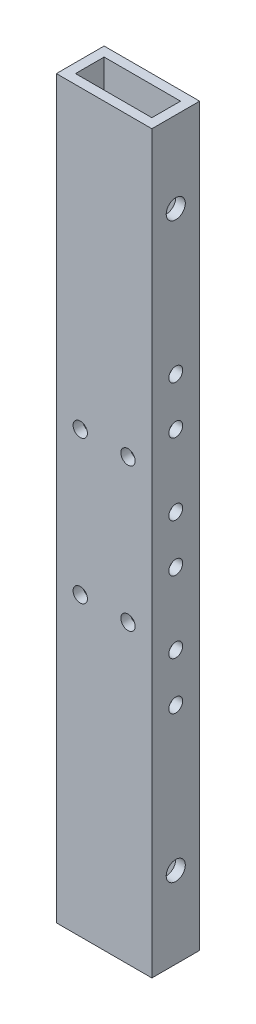
ISO-10303-21;
HEADER;
FILE_DESCRIPTION(('STEP AP214'),'2;1');
FILE_NAME('part.step','',(''),(''),'','','');
FILE_SCHEMA(('AUTOMOTIVE_DESIGN { 1 0 10303 214 1 1 1 1 }'));
ENDSEC;
DATA;
#1=APPLICATION_CONTEXT('core data for automotive mechanical design processes');
#2=APPLICATION_PROTOCOL_DEFINITION('international standard','automotive_design',2000,#1);
#3=PRODUCT_CONTEXT('',#1,'mechanical');
#4=PRODUCT('Part','Part','',(#3));
#5=PRODUCT_RELATED_PRODUCT_CATEGORY('part','',(#4));
#6=PRODUCT_DEFINITION_FORMATION('','',#4);
#7=PRODUCT_DEFINITION_CONTEXT('part definition',#1,'design');
#8=PRODUCT_DEFINITION('design','',#6,#7);
#9=PRODUCT_DEFINITION_SHAPE('','',#8);
#10=(LENGTH_UNIT() NAMED_UNIT(*) SI_UNIT(.MILLI.,.METRE.));
#11=(NAMED_UNIT(*) PLANE_ANGLE_UNIT() SI_UNIT($,.RADIAN.));
#12=(NAMED_UNIT(*) SI_UNIT($,.STERADIAN.) SOLID_ANGLE_UNIT());
#13=UNCERTAINTY_MEASURE_WITH_UNIT(LENGTH_MEASURE(1.E-05),#10,'distance_accuracy_value','');
#14=(GEOMETRIC_REPRESENTATION_CONTEXT(3) GLOBAL_UNCERTAINTY_ASSIGNED_CONTEXT((#13)) GLOBAL_UNIT_ASSIGNED_CONTEXT((#10,
#11,#12)) REPRESENTATION_CONTEXT('',''));
#15=CARTESIAN_POINT('',(0.,0.,0.));
#16=DIRECTION('',(0.,0.,1.));
#17=DIRECTION('',(1.,0.,0.));
#18=AXIS2_PLACEMENT_3D('',#15,#16,#17);
#19=CARTESIAN_POINT('',(0.,77.,0.));
#20=DIRECTION('',(0.,1.,0.));
#21=DIRECTION('',(0.,0.,1.));
#22=AXIS2_PLACEMENT_3D('',#19,#20,#21);
#23=PLANE('',#22);
#24=DIRECTION('',(0.,0.,-1.));
#25=VECTOR('',#24,1.);
#26=CARTESIAN_POINT('',(10.,77.,-5.));
#27=LINE('',#26,#25);
#28=CARTESIAN_POINT('',(10.,77.,5.));
#29=VERTEX_POINT('',#28);
#30=CARTESIAN_POINT('',(10.,77.,-5.));
#31=VERTEX_POINT('',#30);
#32=EDGE_CURVE('E140',#29,#31,#27,.T.);
#33=ORIENTED_EDGE('',*,*,#32,.T.);
#34=DIRECTION('',(-1.,0.,0.));
#35=VECTOR('',#34,1.);
#36=CARTESIAN_POINT('',(-10.,77.,-5.));
#37=LINE('',#36,#35);
#38=CARTESIAN_POINT('',(-10.,77.,-5.));
#39=VERTEX_POINT('',#38);
#40=EDGE_CURVE('E143',#31,#39,#37,.T.);
#41=ORIENTED_EDGE('',*,*,#40,.T.);
#42=DIRECTION('',(0.,0.,1.));
#43=VECTOR('',#42,1.);
#44=CARTESIAN_POINT('',(-10.,77.,-5.));
#45=LINE('',#44,#43);
#46=CARTESIAN_POINT('',(-10.,77.,5.));
#47=VERTEX_POINT('',#46);
#48=EDGE_CURVE('E146',#39,#47,#45,.T.);
#49=ORIENTED_EDGE('',*,*,#48,.T.);
#50=DIRECTION('',(1.,0.,0.));
#51=VECTOR('',#50,1.);
#52=CARTESIAN_POINT('',(-10.,77.,5.));
#53=LINE('',#52,#51);
#54=EDGE_CURVE('E148',#47,#29,#53,.T.);
#55=ORIENTED_EDGE('',*,*,#54,.T.);
#56=EDGE_LOOP('',(#33,#41,#49,#55));
#57=FACE_BOUND('',#56,.T.);
#58=DIRECTION('',(-1.,0.,0.));
#59=VECTOR('',#58,1.);
#60=CARTESIAN_POINT('',(-8.,77.,-3.));
#61=LINE('',#60,#59);
#62=CARTESIAN_POINT('',(8.,77.,-3.));
#63=VERTEX_POINT('',#62);
#64=CARTESIAN_POINT('',(-8.,77.,-3.));
#65=VERTEX_POINT('',#64);
#66=EDGE_CURVE('E110',#63,#65,#61,.T.);
#67=ORIENTED_EDGE('',*,*,#66,.F.);
#68=DIRECTION('',(0.,0.,-1.));
#69=VECTOR('',#68,1.);
#70=CARTESIAN_POINT('',(8.,77.,-3.));
#71=LINE('',#70,#69);
#72=CARTESIAN_POINT('',(8.,77.,3.));
#73=VERTEX_POINT('',#72);
#74=EDGE_CURVE('E102',#73,#63,#71,.T.);
#75=ORIENTED_EDGE('',*,*,#74,.F.);
#76=DIRECTION('',(1.,0.,0.));
#77=VECTOR('',#76,1.);
#78=CARTESIAN_POINT('',(-8.,77.,3.));
#79=LINE('',#78,#77);
#80=CARTESIAN_POINT('',(-8.,77.,3.));
#81=VERTEX_POINT('',#80);
#82=EDGE_CURVE('E124',#81,#73,#79,.T.);
#83=ORIENTED_EDGE('',*,*,#82,.F.);
#84=DIRECTION('',(0.,0.,1.));
#85=VECTOR('',#84,1.);
#86=CARTESIAN_POINT('',(-8.,77.,-3.));
#87=LINE('',#86,#85);
#88=EDGE_CURVE('E122',#65,#81,#87,.T.);
#89=ORIENTED_EDGE('',*,*,#88,.F.);
#90=EDGE_LOOP('',(#67,#75,#83,#89));
#91=FACE_BOUND('',#90,.T.);
#92=ADVANCED_FACE('F35',(#57,#91),#23,.T.);
#93=CARTESIAN_POINT('',(0.,-77.,0.));
#94=DIRECTION('',(0.,1.,0.));
#95=DIRECTION('',(0.,0.,1.));
#96=AXIS2_PLACEMENT_3D('',#93,#94,#95);
#97=PLANE('',#96);
#98=DIRECTION('',(0.,0.,-1.));
#99=VECTOR('',#98,1.);
#100=CARTESIAN_POINT('',(10.,-77.,-5.));
#101=LINE('',#100,#99);
#102=CARTESIAN_POINT('',(10.,-77.,5.));
#103=VERTEX_POINT('',#102);
#104=CARTESIAN_POINT('',(10.,-77.,-5.));
#105=VERTEX_POINT('',#104);
#106=EDGE_CURVE('E118',#103,#105,#101,.T.);
#107=ORIENTED_EDGE('',*,*,#106,.F.);
#108=DIRECTION('',(1.,0.,0.));
#109=VECTOR('',#108,1.);
#110=CARTESIAN_POINT('',(-10.,-77.,5.));
#111=LINE('',#110,#109);
#112=CARTESIAN_POINT('',(-10.,-77.,5.));
#113=VERTEX_POINT('',#112);
#114=EDGE_CURVE('E144',#113,#103,#111,.T.);
#115=ORIENTED_EDGE('',*,*,#114,.F.);
#116=DIRECTION('',(0.,0.,1.));
#117=VECTOR('',#116,1.);
#118=CARTESIAN_POINT('',(-10.,-77.,-5.));
#119=LINE('',#118,#117);
#120=CARTESIAN_POINT('',(-10.,-77.,-5.));
#121=VERTEX_POINT('',#120);
#122=EDGE_CURVE('E155',#121,#113,#119,.T.);
#123=ORIENTED_EDGE('',*,*,#122,.F.);
#124=DIRECTION('',(-1.,0.,0.));
#125=VECTOR('',#124,1.);
#126=CARTESIAN_POINT('',(-10.,-77.,-5.));
#127=LINE('',#126,#125);
#128=EDGE_CURVE('E153',#105,#121,#127,.T.);
#129=ORIENTED_EDGE('',*,*,#128,.F.);
#130=EDGE_LOOP('',(#107,#115,#123,#129));
#131=FACE_BOUND('',#130,.T.);
#132=DIRECTION('',(0.,0.,-1.));
#133=VECTOR('',#132,1.);
#134=CARTESIAN_POINT('',(8.,-77.,-3.));
#135=LINE('',#134,#133);
#136=CARTESIAN_POINT('',(8.,-77.,3.));
#137=VERTEX_POINT('',#136);
#138=CARTESIAN_POINT('',(8.,-77.,-3.));
#139=VERTEX_POINT('',#138);
#140=EDGE_CURVE('E60',#137,#139,#135,.T.);
#141=ORIENTED_EDGE('',*,*,#140,.T.);
#142=DIRECTION('',(-1.,0.,0.));
#143=VECTOR('',#142,1.);
#144=CARTESIAN_POINT('',(-8.,-77.,-3.));
#145=LINE('',#144,#143);
#146=CARTESIAN_POINT('',(-8.,-77.,-3.));
#147=VERTEX_POINT('',#146);
#148=EDGE_CURVE('E117',#139,#147,#145,.T.);
#149=ORIENTED_EDGE('',*,*,#148,.T.);
#150=DIRECTION('',(0.,0.,1.));
#151=VECTOR('',#150,1.);
#152=CARTESIAN_POINT('',(-8.,-77.,-3.));
#153=LINE('',#152,#151);
#154=CARTESIAN_POINT('',(-8.,-77.,3.));
#155=VERTEX_POINT('',#154);
#156=EDGE_CURVE('E132',#147,#155,#153,.T.);
#157=ORIENTED_EDGE('',*,*,#156,.T.);
#158=DIRECTION('',(1.,0.,0.));
#159=VECTOR('',#158,1.);
#160=CARTESIAN_POINT('',(-8.,-77.,3.));
#161=LINE('',#160,#159);
#162=EDGE_CURVE('E111',#155,#137,#161,.T.);
#163=ORIENTED_EDGE('',*,*,#162,.T.);
#164=EDGE_LOOP('',(#141,#149,#157,#163));
#165=FACE_BOUND('',#164,.T.);
#166=ADVANCED_FACE('F318',(#131,#165),#97,.F.);
#167=CARTESIAN_POINT('',(10.,77.,-5.));
#168=DIRECTION('',(-1.,0.,0.));
#169=DIRECTION('',(0.,0.,1.));
#170=AXIS2_PLACEMENT_3D('',#167,#168,#169);
#171=PLANE('',#170);
#172=CARTESIAN_POINT('',(10.,20.,0.));
#173=DIRECTION('',(1.,0.,0.));
#174=DIRECTION('',(0.,0.,-1.));
#175=AXIS2_PLACEMENT_3D('',#172,#173,#174);
#176=CIRCLE('',#175,1.45);
#177=CARTESIAN_POINT('',(10.,20.,-1.45));
#178=VERTEX_POINT('',#177);
#179=EDGE_CURVE('E245',#178,#178,#176,.T.);
#180=ORIENTED_EDGE('',*,*,#179,.F.);
#181=EDGE_LOOP('',(#180));
#182=FACE_BOUND('',#181,.T.);
#183=CARTESIAN_POINT('',(10.,30.,0.));
#184=DIRECTION('',(1.,0.,0.));
#185=DIRECTION('',(0.,0.,-1.));
#186=AXIS2_PLACEMENT_3D('',#183,#184,#185);
#187=CIRCLE('',#186,1.45);
#188=CARTESIAN_POINT('',(10.,30.,-1.45));
#189=VERTEX_POINT('',#188);
#190=EDGE_CURVE('E251',#189,#189,#187,.T.);
#191=ORIENTED_EDGE('',*,*,#190,.F.);
#192=EDGE_LOOP('',(#191));
#193=FACE_BOUND('',#192,.T.);
#194=CARTESIAN_POINT('',(10.,-30.,0.));
#195=DIRECTION('',(1.,0.,0.));
#196=DIRECTION('',(0.,0.,1.));
#197=AXIS2_PLACEMENT_3D('',#194,#195,#196);
#198=CIRCLE('',#197,1.45);
#199=CARTESIAN_POINT('',(10.,-30.,1.45));
#200=VERTEX_POINT('',#199);
#201=EDGE_CURVE('E257',#200,#200,#198,.T.);
#202=ORIENTED_EDGE('',*,*,#201,.F.);
#203=EDGE_LOOP('',(#202));
#204=FACE_BOUND('',#203,.T.);
#205=CARTESIAN_POINT('',(10.,-20.,0.));
#206=DIRECTION('',(1.,0.,0.));
#207=DIRECTION('',(0.,0.,1.));
#208=AXIS2_PLACEMENT_3D('',#205,#206,#207);
#209=CIRCLE('',#208,1.45);
#210=CARTESIAN_POINT('',(10.,-20.,1.45));
#211=VERTEX_POINT('',#210);
#212=EDGE_CURVE('E226',#211,#211,#209,.T.);
#213=ORIENTED_EDGE('',*,*,#212,.F.);
#214=EDGE_LOOP('',(#213));
#215=FACE_BOUND('',#214,.T.);
#216=CARTESIAN_POINT('',(10.,-5.,0.));
#217=DIRECTION('',(1.,0.,0.));
#218=DIRECTION('',(0.,0.,1.));
#219=AXIS2_PLACEMENT_3D('',#216,#217,#218);
#220=CIRCLE('',#219,1.45);
#221=CARTESIAN_POINT('',(10.,-5.,1.45));
#222=VERTEX_POINT('',#221);
#223=EDGE_CURVE('E227',#222,#222,#220,.T.);
#224=ORIENTED_EDGE('',*,*,#223,.F.);
#225=EDGE_LOOP('',(#224));
#226=FACE_BOUND('',#225,.T.);
#227=CARTESIAN_POINT('',(10.,60.,0.));
#228=DIRECTION('',(1.,0.,0.));
#229=DIRECTION('',(0.,0.,-1.));
#230=AXIS2_PLACEMENT_3D('',#227,#228,#229);
#231=CIRCLE('',#230,2.);
#232=CARTESIAN_POINT('',(10.,60.,-1.99999999999999));
#233=VERTEX_POINT('',#232);
#234=EDGE_CURVE('E233',#233,#233,#231,.T.);
#235=ORIENTED_EDGE('',*,*,#234,.F.);
#236=EDGE_LOOP('',(#235));
#237=FACE_BOUND('',#236,.T.);
#238=CARTESIAN_POINT('',(10.,-60.,0.));
#239=DIRECTION('',(1.,0.,0.));
#240=DIRECTION('',(0.,0.,1.));
#241=AXIS2_PLACEMENT_3D('',#238,#239,#240);
#242=CIRCLE('',#241,2.);
#243=CARTESIAN_POINT('',(10.,-60.,1.99999999999999));
#244=VERTEX_POINT('',#243);
#245=EDGE_CURVE('E222',#244,#244,#242,.T.);
#246=ORIENTED_EDGE('',*,*,#245,.F.);
#247=EDGE_LOOP('',(#246));
#248=FACE_BOUND('',#247,.T.);
#249=CARTESIAN_POINT('',(10.,5.,0.));
#250=DIRECTION('',(1.,0.,0.));
#251=DIRECTION('',(0.,0.,-1.));
#252=AXIS2_PLACEMENT_3D('',#249,#250,#251);
#253=CIRCLE('',#252,1.45);
#254=CARTESIAN_POINT('',(10.,5.,-1.45));
#255=VERTEX_POINT('',#254);
#256=EDGE_CURVE('E244',#255,#255,#253,.T.);
#257=ORIENTED_EDGE('',*,*,#256,.F.);
#258=EDGE_LOOP('',(#257));
#259=FACE_BOUND('',#258,.T.);
#260=ORIENTED_EDGE('',*,*,#106,.T.);
#261=DIRECTION('',(0.,-1.,0.));
#262=VECTOR('',#261,1.);
#263=CARTESIAN_POINT('',(10.,77.,-5.));
#264=LINE('',#263,#262);
#265=EDGE_CURVE('E11',#31,#105,#264,.T.);
#266=ORIENTED_EDGE('',*,*,#265,.F.);
#267=ORIENTED_EDGE('',*,*,#32,.F.);
#268=DIRECTION('',(0.,-1.,0.));
#269=VECTOR('',#268,1.);
#270=CARTESIAN_POINT('',(10.,77.,5.));
#271=LINE('',#270,#269);
#272=EDGE_CURVE('E150',#29,#103,#271,.T.);
#273=ORIENTED_EDGE('',*,*,#272,.T.);
#274=EDGE_LOOP('',(#260,#266,#267,#273));
#275=FACE_BOUND('',#274,.T.);
#276=ADVANCED_FACE('F37',(#182,#193,#204,#215,#226,#237,#248,#259,#275),#171,.F.);
#277=CARTESIAN_POINT('',(-10.,77.,-5.));
#278=DIRECTION('',(0.,0.,1.));
#279=DIRECTION('',(1.,0.,0.));
#280=AXIS2_PLACEMENT_3D('',#277,#278,#279);
#281=PLANE('',#280);
#282=CARTESIAN_POINT('',(5.,-14.9999999999998,-5.));
#283=DIRECTION('',(0.,0.,-1.));
#284=DIRECTION('',(-1.,0.,0.));
#285=AXIS2_PLACEMENT_3D('',#282,#283,#284);
#286=CIRCLE('',#285,1.5);
#287=CARTESIAN_POINT('',(3.5,-14.9999999999998,-5.));
#288=VERTEX_POINT('',#287);
#289=EDGE_CURVE('E443',#288,#288,#286,.T.);
#290=ORIENTED_EDGE('',*,*,#289,.F.);
#291=EDGE_LOOP('',(#290));
#292=FACE_BOUND('',#291,.T.);
#293=CARTESIAN_POINT('',(-5.,14.9999999999998,-5.));
#294=DIRECTION('',(0.,0.,-1.));
#295=DIRECTION('',(1.,0.,0.));
#296=AXIS2_PLACEMENT_3D('',#293,#294,#295);
#297=CIRCLE('',#296,1.5);
#298=CARTESIAN_POINT('',(-3.5,14.9999999999998,-5.));
#299=VERTEX_POINT('',#298);
#300=EDGE_CURVE('E436',#299,#299,#297,.T.);
#301=ORIENTED_EDGE('',*,*,#300,.F.);
#302=EDGE_LOOP('',(#301));
#303=FACE_BOUND('',#302,.T.);
#304=CARTESIAN_POINT('',(5.,14.9999999999998,-5.));
#305=DIRECTION('',(0.,0.,-1.));
#306=DIRECTION('',(1.,0.,0.));
#307=AXIS2_PLACEMENT_3D('',#304,#305,#306);
#308=CIRCLE('',#307,1.5);
#309=CARTESIAN_POINT('',(6.5,14.9999999999998,-5.));
#310=VERTEX_POINT('',#309);
#311=EDGE_CURVE('E431',#310,#310,#308,.T.);
#312=ORIENTED_EDGE('',*,*,#311,.F.);
#313=EDGE_LOOP('',(#312));
#314=FACE_BOUND('',#313,.T.);
#315=CARTESIAN_POINT('',(-5.,-14.9999999999998,-5.));
#316=DIRECTION('',(0.,0.,-1.));
#317=DIRECTION('',(-1.,0.,0.));
#318=AXIS2_PLACEMENT_3D('',#315,#316,#317);
#319=CIRCLE('',#318,1.5);
#320=CARTESIAN_POINT('',(-6.5,-14.9999999999998,-5.));
#321=VERTEX_POINT('',#320);
#322=EDGE_CURVE('E442',#321,#321,#319,.T.);
#323=ORIENTED_EDGE('',*,*,#322,.F.);
#324=EDGE_LOOP('',(#323));
#325=FACE_BOUND('',#324,.T.);
#326=ORIENTED_EDGE('',*,*,#128,.T.);
#327=DIRECTION('',(0.,-1.,0.));
#328=VECTOR('',#327,1.);
#329=CARTESIAN_POINT('',(-10.,77.,-5.));
#330=LINE('',#329,#328);
#331=EDGE_CURVE('E44',#39,#121,#330,.T.);
#332=ORIENTED_EDGE('',*,*,#331,.F.);
#333=ORIENTED_EDGE('',*,*,#40,.F.);
#334=ORIENTED_EDGE('',*,*,#265,.T.);
#335=EDGE_LOOP('',(#326,#332,#333,#334));
#336=FACE_BOUND('',#335,.T.);
#337=ADVANCED_FACE('F317',(#292,#303,#314,#325,#336),#281,.F.);
#338=CARTESIAN_POINT('',(-10.,77.,-5.));
#339=DIRECTION('',(1.,0.,0.));
#340=DIRECTION('',(0.,0.,-1.));
#341=AXIS2_PLACEMENT_3D('',#338,#339,#340);
#342=PLANE('',#341);
#343=CARTESIAN_POINT('',(-10.,20.,0.));
#344=DIRECTION('',(1.,0.,0.));
#345=DIRECTION('',(0.,0.,-1.));
#346=AXIS2_PLACEMENT_3D('',#343,#344,#345);
#347=CIRCLE('',#346,1.45);
#348=CARTESIAN_POINT('',(-10.,20.,-1.45));
#349=VERTEX_POINT('',#348);
#350=EDGE_CURVE('E241',#349,#349,#347,.T.);
#351=ORIENTED_EDGE('',*,*,#350,.T.);
#352=EDGE_LOOP('',(#351));
#353=FACE_BOUND('',#352,.T.);
#354=CARTESIAN_POINT('',(-10.,30.,0.));
#355=DIRECTION('',(1.,0.,0.));
#356=DIRECTION('',(0.,0.,-1.));
#357=AXIS2_PLACEMENT_3D('',#354,#355,#356);
#358=CIRCLE('',#357,1.45);
#359=CARTESIAN_POINT('',(-10.,30.,-1.45));
#360=VERTEX_POINT('',#359);
#361=EDGE_CURVE('E248',#360,#360,#358,.T.);
#362=ORIENTED_EDGE('',*,*,#361,.T.);
#363=EDGE_LOOP('',(#362));
#364=FACE_BOUND('',#363,.T.);
#365=CARTESIAN_POINT('',(-10.,-30.,0.));
#366=DIRECTION('',(1.,0.,0.));
#367=DIRECTION('',(0.,0.,1.));
#368=AXIS2_PLACEMENT_3D('',#365,#366,#367);
#369=CIRCLE('',#368,1.45);
#370=CARTESIAN_POINT('',(-10.,-30.,1.45));
#371=VERTEX_POINT('',#370);
#372=EDGE_CURVE('E254',#371,#371,#369,.T.);
#373=ORIENTED_EDGE('',*,*,#372,.T.);
#374=EDGE_LOOP('',(#373));
#375=FACE_BOUND('',#374,.T.);
#376=CARTESIAN_POINT('',(-10.,-20.,0.));
#377=DIRECTION('',(1.,0.,0.));
#378=DIRECTION('',(0.,0.,1.));
#379=AXIS2_PLACEMENT_3D('',#376,#377,#378);
#380=CIRCLE('',#379,1.45);
#381=CARTESIAN_POINT('',(-10.,-20.,1.45));
#382=VERTEX_POINT('',#381);
#383=EDGE_CURVE('E260',#382,#382,#380,.T.);
#384=ORIENTED_EDGE('',*,*,#383,.T.);
#385=EDGE_LOOP('',(#384));
#386=FACE_BOUND('',#385,.T.);
#387=CARTESIAN_POINT('',(-10.,-5.,0.));
#388=DIRECTION('',(1.,0.,0.));
#389=DIRECTION('',(0.,0.,1.));
#390=AXIS2_PLACEMENT_3D('',#387,#388,#389);
#391=CIRCLE('',#390,1.45);
#392=CARTESIAN_POINT('',(-10.,-5.,1.45));
#393=VERTEX_POINT('',#392);
#394=EDGE_CURVE('E223',#393,#393,#391,.T.);
#395=ORIENTED_EDGE('',*,*,#394,.T.);
#396=EDGE_LOOP('',(#395));
#397=FACE_BOUND('',#396,.T.);
#398=CARTESIAN_POINT('',(-10.,60.,0.));
#399=DIRECTION('',(1.,0.,0.));
#400=DIRECTION('',(0.,0.,-1.));
#401=AXIS2_PLACEMENT_3D('',#398,#399,#400);
#402=CIRCLE('',#401,2.);
#403=CARTESIAN_POINT('',(-10.,60.,-1.99999999999999));
#404=VERTEX_POINT('',#403);
#405=EDGE_CURVE('E230',#404,#404,#402,.T.);
#406=ORIENTED_EDGE('',*,*,#405,.T.);
#407=EDGE_LOOP('',(#406));
#408=FACE_BOUND('',#407,.T.);
#409=CARTESIAN_POINT('',(-10.,-60.,0.));
#410=DIRECTION('',(1.,0.,0.));
#411=DIRECTION('',(0.,0.,1.));
#412=AXIS2_PLACEMENT_3D('',#409,#410,#411);
#413=CIRCLE('',#412,2.);
#414=CARTESIAN_POINT('',(-10.,-60.,1.99999999999999));
#415=VERTEX_POINT('',#414);
#416=EDGE_CURVE('E236',#415,#415,#413,.T.);
#417=ORIENTED_EDGE('',*,*,#416,.T.);
#418=EDGE_LOOP('',(#417));
#419=FACE_BOUND('',#418,.T.);
#420=CARTESIAN_POINT('',(-10.,5.,0.));
#421=DIRECTION('',(1.,0.,0.));
#422=DIRECTION('',(0.,0.,-1.));
#423=AXIS2_PLACEMENT_3D('',#420,#421,#422);
#424=CIRCLE('',#423,1.45);
#425=CARTESIAN_POINT('',(-10.,5.,-1.45));
#426=VERTEX_POINT('',#425);
#427=EDGE_CURVE('E169',#426,#426,#424,.T.);
#428=ORIENTED_EDGE('',*,*,#427,.T.);
#429=EDGE_LOOP('',(#428));
#430=FACE_BOUND('',#429,.T.);
#431=ORIENTED_EDGE('',*,*,#122,.T.);
#432=DIRECTION('',(0.,-1.,0.));
#433=VECTOR('',#432,1.);
#434=CARTESIAN_POINT('',(-10.,77.,5.));
#435=LINE('',#434,#433);
#436=EDGE_CURVE('E160',#47,#113,#435,.T.);
#437=ORIENTED_EDGE('',*,*,#436,.F.);
#438=ORIENTED_EDGE('',*,*,#48,.F.);
#439=ORIENTED_EDGE('',*,*,#331,.T.);
#440=EDGE_LOOP('',(#431,#437,#438,#439));
#441=FACE_BOUND('',#440,.T.);
#442=ADVANCED_FACE('F336',(#353,#364,#375,#386,#397,#408,#419,#430,#441),#342,.F.);
#443=CARTESIAN_POINT('',(-10.,77.,5.));
#444=DIRECTION('',(0.,0.,-1.));
#445=DIRECTION('',(-1.,0.,0.));
#446=AXIS2_PLACEMENT_3D('',#443,#444,#445);
#447=PLANE('',#446);
#448=CARTESIAN_POINT('',(5.,-14.9999999999998,5.));
#449=DIRECTION('',(0.,0.,-1.));
#450=DIRECTION('',(-1.,0.,0.));
#451=AXIS2_PLACEMENT_3D('',#448,#449,#450);
#452=CIRCLE('',#451,1.5);
#453=CARTESIAN_POINT('',(3.5,-14.9999999999998,5.));
#454=VERTEX_POINT('',#453);
#455=EDGE_CURVE('E439',#454,#454,#452,.T.);
#456=ORIENTED_EDGE('',*,*,#455,.T.);
#457=EDGE_LOOP('',(#456));
#458=FACE_BOUND('',#457,.T.);
#459=CARTESIAN_POINT('',(-5.,14.9999999999998,5.));
#460=DIRECTION('',(0.,0.,-1.));
#461=DIRECTION('',(1.,0.,0.));
#462=AXIS2_PLACEMENT_3D('',#459,#460,#461);
#463=CIRCLE('',#462,1.5);
#464=CARTESIAN_POINT('',(-3.5,14.9999999999998,5.));
#465=VERTEX_POINT('',#464);
#466=EDGE_CURVE('E446',#465,#465,#463,.T.);
#467=ORIENTED_EDGE('',*,*,#466,.T.);
#468=EDGE_LOOP('',(#467));
#469=FACE_BOUND('',#468,.T.);
#470=CARTESIAN_POINT('',(5.,14.9999999999998,5.));
#471=DIRECTION('',(0.,0.,-1.));
#472=DIRECTION('',(1.,0.,0.));
#473=AXIS2_PLACEMENT_3D('',#470,#471,#472);
#474=CIRCLE('',#473,1.5);
#475=CARTESIAN_POINT('',(6.5,14.9999999999998,5.));
#476=VERTEX_POINT('',#475);
#477=EDGE_CURVE('E433',#476,#476,#474,.T.);
#478=ORIENTED_EDGE('',*,*,#477,.T.);
#479=EDGE_LOOP('',(#478));
#480=FACE_BOUND('',#479,.T.);
#481=CARTESIAN_POINT('',(-5.,-14.9999999999998,5.));
#482=DIRECTION('',(0.,0.,-1.));
#483=DIRECTION('',(-1.,0.,0.));
#484=AXIS2_PLACEMENT_3D('',#481,#482,#483);
#485=CIRCLE('',#484,1.5);
#486=CARTESIAN_POINT('',(-6.5,-14.9999999999998,5.));
#487=VERTEX_POINT('',#486);
#488=EDGE_CURVE('E201',#487,#487,#485,.T.);
#489=ORIENTED_EDGE('',*,*,#488,.T.);
#490=EDGE_LOOP('',(#489));
#491=FACE_BOUND('',#490,.T.);
#492=ORIENTED_EDGE('',*,*,#114,.T.);
#493=ORIENTED_EDGE('',*,*,#272,.F.);
#494=ORIENTED_EDGE('',*,*,#54,.F.);
#495=ORIENTED_EDGE('',*,*,#436,.T.);
#496=EDGE_LOOP('',(#492,#493,#494,#495));
#497=FACE_BOUND('',#496,.T.);
#498=ADVANCED_FACE('F290',(#458,#469,#480,#491,#497),#447,.F.);
#499=CARTESIAN_POINT('',(8.,77.,-3.));
#500=DIRECTION('',(-1.,0.,0.));
#501=DIRECTION('',(0.,0.,1.));
#502=AXIS2_PLACEMENT_3D('',#499,#500,#501);
#503=PLANE('',#502);
#504=CARTESIAN_POINT('',(8.,20.,0.));
#505=DIRECTION('',(-1.,0.,0.));
#506=DIRECTION('',(0.,0.,1.));
#507=AXIS2_PLACEMENT_3D('',#504,#505,#506);
#508=CIRCLE('',#507,1.45);
#509=CARTESIAN_POINT('',(8.,20.,1.45));
#510=VERTEX_POINT('',#509);
#511=EDGE_CURVE('E130',#510,#510,#508,.T.);
#512=ORIENTED_EDGE('',*,*,#511,.F.);
#513=EDGE_LOOP('',(#512));
#514=FACE_BOUND('',#513,.T.);
#515=CARTESIAN_POINT('',(8.,30.,0.));
#516=DIRECTION('',(-1.,0.,0.));
#517=DIRECTION('',(0.,0.,1.));
#518=AXIS2_PLACEMENT_3D('',#515,#516,#517);
#519=CIRCLE('',#518,1.45);
#520=CARTESIAN_POINT('',(8.,30.,1.45));
#521=VERTEX_POINT('',#520);
#522=EDGE_CURVE('E193',#521,#521,#519,.T.);
#523=ORIENTED_EDGE('',*,*,#522,.F.);
#524=EDGE_LOOP('',(#523));
#525=FACE_BOUND('',#524,.T.);
#526=CARTESIAN_POINT('',(8.,-30.,0.));
#527=DIRECTION('',(-1.,0.,0.));
#528=DIRECTION('',(0.,0.,1.));
#529=AXIS2_PLACEMENT_3D('',#526,#527,#528);
#530=CIRCLE('',#529,1.45);
#531=CARTESIAN_POINT('',(8.,-30.,1.45));
#532=VERTEX_POINT('',#531);
#533=EDGE_CURVE('E189',#532,#532,#530,.T.);
#534=ORIENTED_EDGE('',*,*,#533,.F.);
#535=EDGE_LOOP('',(#534));
#536=FACE_BOUND('',#535,.T.);
#537=CARTESIAN_POINT('',(8.,-20.,0.));
#538=DIRECTION('',(-1.,0.,0.));
#539=DIRECTION('',(0.,0.,1.));
#540=AXIS2_PLACEMENT_3D('',#537,#538,#539);
#541=CIRCLE('',#540,1.45);
#542=CARTESIAN_POINT('',(8.,-20.,1.45));
#543=VERTEX_POINT('',#542);
#544=EDGE_CURVE('E185',#543,#543,#541,.T.);
#545=ORIENTED_EDGE('',*,*,#544,.F.);
#546=EDGE_LOOP('',(#545));
#547=FACE_BOUND('',#546,.T.);
#548=CARTESIAN_POINT('',(8.,-5.,0.));
#549=DIRECTION('',(-1.,0.,0.));
#550=DIRECTION('',(0.,0.,1.));
#551=AXIS2_PLACEMENT_3D('',#548,#549,#550);
#552=CIRCLE('',#551,1.45);
#553=CARTESIAN_POINT('',(8.,-5.,1.45));
#554=VERTEX_POINT('',#553);
#555=EDGE_CURVE('E181',#554,#554,#552,.T.);
#556=ORIENTED_EDGE('',*,*,#555,.F.);
#557=EDGE_LOOP('',(#556));
#558=FACE_BOUND('',#557,.T.);
#559=CARTESIAN_POINT('',(8.,60.,0.));
#560=DIRECTION('',(-1.,0.,0.));
#561=DIRECTION('',(0.,0.,1.));
#562=AXIS2_PLACEMENT_3D('',#559,#560,#561);
#563=CIRCLE('',#562,2.);
#564=CARTESIAN_POINT('',(8.,60.,2.00000000000001));
#565=VERTEX_POINT('',#564);
#566=EDGE_CURVE('E177',#565,#565,#563,.T.);
#567=ORIENTED_EDGE('',*,*,#566,.F.);
#568=EDGE_LOOP('',(#567));
#569=FACE_BOUND('',#568,.T.);
#570=CARTESIAN_POINT('',(8.,-60.,0.));
#571=DIRECTION('',(-1.,0.,0.));
#572=DIRECTION('',(0.,0.,1.));
#573=AXIS2_PLACEMENT_3D('',#570,#571,#572);
#574=CIRCLE('',#573,2.);
#575=CARTESIAN_POINT('',(8.,-60.,1.99999999999999));
#576=VERTEX_POINT('',#575);
#577=EDGE_CURVE('E173',#576,#576,#574,.T.);
#578=ORIENTED_EDGE('',*,*,#577,.F.);
#579=EDGE_LOOP('',(#578));
#580=FACE_BOUND('',#579,.T.);
#581=CARTESIAN_POINT('',(8.,5.,0.));
#582=DIRECTION('',(-1.,0.,0.));
#583=DIRECTION('',(0.,0.,1.));
#584=AXIS2_PLACEMENT_3D('',#581,#582,#583);
#585=CIRCLE('',#584,1.45);
#586=CARTESIAN_POINT('',(8.,5.,1.45));
#587=VERTEX_POINT('',#586);
#588=EDGE_CURVE('E168',#587,#587,#585,.T.);
#589=ORIENTED_EDGE('',*,*,#588,.F.);
#590=EDGE_LOOP('',(#589));
#591=FACE_BOUND('',#590,.T.);
#592=ORIENTED_EDGE('',*,*,#140,.F.);
#593=DIRECTION('',(0.,-1.,0.));
#594=VECTOR('',#593,1.);
#595=CARTESIAN_POINT('',(8.,77.,3.));
#596=LINE('',#595,#594);
#597=EDGE_CURVE('E106',#73,#137,#596,.T.);
#598=ORIENTED_EDGE('',*,*,#597,.F.);
#599=ORIENTED_EDGE('',*,*,#74,.T.);
#600=DIRECTION('',(0.,-1.,0.));
#601=VECTOR('',#600,1.);
#602=CARTESIAN_POINT('',(8.,77.,-3.));
#603=LINE('',#602,#601);
#604=EDGE_CURVE('E105',#63,#139,#603,.T.);
#605=ORIENTED_EDGE('',*,*,#604,.T.);
#606=EDGE_LOOP('',(#592,#598,#599,#605));
#607=FACE_BOUND('',#606,.T.);
#608=ADVANCED_FACE('F104',(#514,#525,#536,#547,#558,#569,#580,#591,#607),#503,.T.);
#609=CARTESIAN_POINT('',(-8.,77.,-3.));
#610=DIRECTION('',(0.,0.,1.));
#611=DIRECTION('',(1.,0.,0.));
#612=AXIS2_PLACEMENT_3D('',#609,#610,#611);
#613=PLANE('',#612);
#614=CARTESIAN_POINT('',(5.,-14.9999999999998,-3.));
#615=DIRECTION('',(0.,0.,1.));
#616=DIRECTION('',(1.,0.,0.));
#617=AXIS2_PLACEMENT_3D('',#614,#615,#616);
#618=CIRCLE('',#617,1.5);
#619=CARTESIAN_POINT('',(6.5,-14.9999999999998,-3.));
#620=VERTEX_POINT('',#619);
#621=EDGE_CURVE('E219',#620,#620,#618,.T.);
#622=ORIENTED_EDGE('',*,*,#621,.F.);
#623=EDGE_LOOP('',(#622));
#624=FACE_BOUND('',#623,.T.);
#625=CARTESIAN_POINT('',(-5.,14.9999999999998,-3.));
#626=DIRECTION('',(0.,0.,1.));
#627=DIRECTION('',(1.,0.,0.));
#628=AXIS2_PLACEMENT_3D('',#625,#626,#627);
#629=CIRCLE('',#628,1.5);
#630=CARTESIAN_POINT('',(-3.5,14.9999999999998,-3.));
#631=VERTEX_POINT('',#630);
#632=EDGE_CURVE('E207',#631,#631,#629,.T.);
#633=ORIENTED_EDGE('',*,*,#632,.F.);
#634=EDGE_LOOP('',(#633));
#635=FACE_BOUND('',#634,.T.);
#636=CARTESIAN_POINT('',(5.,14.9999999999998,-3.));
#637=DIRECTION('',(0.,0.,1.));
#638=DIRECTION('',(1.,0.,0.));
#639=AXIS2_PLACEMENT_3D('',#636,#637,#638);
#640=CIRCLE('',#639,1.5);
#641=CARTESIAN_POINT('',(6.5,14.9999999999998,-3.));
#642=VERTEX_POINT('',#641);
#643=EDGE_CURVE('E204',#642,#642,#640,.T.);
#644=ORIENTED_EDGE('',*,*,#643,.F.);
#645=EDGE_LOOP('',(#644));
#646=FACE_BOUND('',#645,.T.);
#647=CARTESIAN_POINT('',(-5.,-14.9999999999998,-3.));
#648=DIRECTION('',(0.,0.,1.));
#649=DIRECTION('',(1.,0.,0.));
#650=AXIS2_PLACEMENT_3D('',#647,#648,#649);
#651=CIRCLE('',#650,1.5);
#652=CARTESIAN_POINT('',(-3.5,-14.9999999999998,-3.));
#653=VERTEX_POINT('',#652);
#654=EDGE_CURVE('E200',#653,#653,#651,.T.);
#655=ORIENTED_EDGE('',*,*,#654,.F.);
#656=EDGE_LOOP('',(#655));
#657=FACE_BOUND('',#656,.T.);
#658=ORIENTED_EDGE('',*,*,#148,.F.);
#659=ORIENTED_EDGE('',*,*,#604,.F.);
#660=ORIENTED_EDGE('',*,*,#66,.T.);
#661=DIRECTION('',(0.,-1.,0.));
#662=VECTOR('',#661,1.);
#663=CARTESIAN_POINT('',(-8.,77.,-3.));
#664=LINE('',#663,#662);
#665=EDGE_CURVE('E119',#65,#147,#664,.T.);
#666=ORIENTED_EDGE('',*,*,#665,.T.);
#667=EDGE_LOOP('',(#658,#659,#660,#666));
#668=FACE_BOUND('',#667,.T.);
#669=ADVANCED_FACE('F114',(#624,#635,#646,#657,#668),#613,.T.);
#670=CARTESIAN_POINT('',(-8.,77.,-3.));
#671=DIRECTION('',(1.,0.,0.));
#672=DIRECTION('',(0.,0.,-1.));
#673=AXIS2_PLACEMENT_3D('',#670,#671,#672);
#674=PLANE('',#673);
#675=CARTESIAN_POINT('',(-8.,20.,0.));
#676=DIRECTION('',(1.,0.,0.));
#677=DIRECTION('',(0.,0.,-1.));
#678=AXIS2_PLACEMENT_3D('',#675,#676,#677);
#679=CIRCLE('',#678,1.45);
#680=CARTESIAN_POINT('',(-8.,20.,-1.45));
#681=VERTEX_POINT('',#680);
#682=EDGE_CURVE('E194',#681,#681,#679,.T.);
#683=ORIENTED_EDGE('',*,*,#682,.F.);
#684=EDGE_LOOP('',(#683));
#685=FACE_BOUND('',#684,.T.);
#686=CARTESIAN_POINT('',(-8.,30.,0.));
#687=DIRECTION('',(1.,0.,0.));
#688=DIRECTION('',(0.,0.,-1.));
#689=AXIS2_PLACEMENT_3D('',#686,#687,#688);
#690=CIRCLE('',#689,1.45);
#691=CARTESIAN_POINT('',(-8.,30.,-1.45));
#692=VERTEX_POINT('',#691);
#693=EDGE_CURVE('E190',#692,#692,#690,.T.);
#694=ORIENTED_EDGE('',*,*,#693,.F.);
#695=EDGE_LOOP('',(#694));
#696=FACE_BOUND('',#695,.T.);
#697=CARTESIAN_POINT('',(-8.,-30.,0.));
#698=DIRECTION('',(1.,0.,0.));
#699=DIRECTION('',(0.,0.,-1.));
#700=AXIS2_PLACEMENT_3D('',#697,#698,#699);
#701=CIRCLE('',#700,1.45);
#702=CARTESIAN_POINT('',(-8.,-30.,-1.45));
#703=VERTEX_POINT('',#702);
#704=EDGE_CURVE('E186',#703,#703,#701,.T.);
#705=ORIENTED_EDGE('',*,*,#704,.F.);
#706=EDGE_LOOP('',(#705));
#707=FACE_BOUND('',#706,.T.);
#708=CARTESIAN_POINT('',(-8.,-20.,0.));
#709=DIRECTION('',(1.,0.,0.));
#710=DIRECTION('',(0.,0.,-1.));
#711=AXIS2_PLACEMENT_3D('',#708,#709,#710);
#712=CIRCLE('',#711,1.45);
#713=CARTESIAN_POINT('',(-8.,-20.,-1.45));
#714=VERTEX_POINT('',#713);
#715=EDGE_CURVE('E182',#714,#714,#712,.T.);
#716=ORIENTED_EDGE('',*,*,#715,.F.);
#717=EDGE_LOOP('',(#716));
#718=FACE_BOUND('',#717,.T.);
#719=CARTESIAN_POINT('',(-8.,-5.,0.));
#720=DIRECTION('',(1.,0.,0.));
#721=DIRECTION('',(0.,0.,-1.));
#722=AXIS2_PLACEMENT_3D('',#719,#720,#721);
#723=CIRCLE('',#722,1.45);
#724=CARTESIAN_POINT('',(-8.,-5.,-1.45));
#725=VERTEX_POINT('',#724);
#726=EDGE_CURVE('E178',#725,#725,#723,.T.);
#727=ORIENTED_EDGE('',*,*,#726,.F.);
#728=EDGE_LOOP('',(#727));
#729=FACE_BOUND('',#728,.T.);
#730=CARTESIAN_POINT('',(-8.,60.,0.));
#731=DIRECTION('',(1.,0.,0.));
#732=DIRECTION('',(0.,0.,-1.));
#733=AXIS2_PLACEMENT_3D('',#730,#731,#732);
#734=CIRCLE('',#733,2.);
#735=CARTESIAN_POINT('',(-8.,60.,-1.99999999999999));
#736=VERTEX_POINT('',#735);
#737=EDGE_CURVE('E174',#736,#736,#734,.T.);
#738=ORIENTED_EDGE('',*,*,#737,.F.);
#739=EDGE_LOOP('',(#738));
#740=FACE_BOUND('',#739,.T.);
#741=CARTESIAN_POINT('',(-8.,-60.,0.));
#742=DIRECTION('',(1.,0.,0.));
#743=DIRECTION('',(0.,0.,-1.));
#744=AXIS2_PLACEMENT_3D('',#741,#742,#743);
#745=CIRCLE('',#744,2.);
#746=CARTESIAN_POINT('',(-8.,-60.,-2.00000000000001));
#747=VERTEX_POINT('',#746);
#748=EDGE_CURVE('E170',#747,#747,#745,.T.);
#749=ORIENTED_EDGE('',*,*,#748,.F.);
#750=EDGE_LOOP('',(#749));
#751=FACE_BOUND('',#750,.T.);
#752=CARTESIAN_POINT('',(-8.,5.,0.));
#753=DIRECTION('',(1.,0.,0.));
#754=DIRECTION('',(0.,0.,-1.));
#755=AXIS2_PLACEMENT_3D('',#752,#753,#754);
#756=CIRCLE('',#755,1.45);
#757=CARTESIAN_POINT('',(-8.,5.,-1.45));
#758=VERTEX_POINT('',#757);
#759=EDGE_CURVE('E165',#758,#758,#756,.T.);
#760=ORIENTED_EDGE('',*,*,#759,.F.);
#761=EDGE_LOOP('',(#760));
#762=FACE_BOUND('',#761,.T.);
#763=ORIENTED_EDGE('',*,*,#156,.F.);
#764=ORIENTED_EDGE('',*,*,#665,.F.);
#765=ORIENTED_EDGE('',*,*,#88,.T.);
#766=DIRECTION('',(0.,-1.,0.));
#767=VECTOR('',#766,1.);
#768=CARTESIAN_POINT('',(-8.,77.,3.));
#769=LINE('',#768,#767);
#770=EDGE_CURVE('E52',#81,#155,#769,.T.);
#771=ORIENTED_EDGE('',*,*,#770,.T.);
#772=EDGE_LOOP('',(#763,#764,#765,#771));
#773=FACE_BOUND('',#772,.T.);
#774=ADVANCED_FACE('F357',(#685,#696,#707,#718,#729,#740,#751,#762,#773),#674,.T.);
#775=CARTESIAN_POINT('',(-8.,77.,3.));
#776=DIRECTION('',(0.,0.,-1.));
#777=DIRECTION('',(-1.,0.,0.));
#778=AXIS2_PLACEMENT_3D('',#775,#776,#777);
#779=PLANE('',#778);
#780=CARTESIAN_POINT('',(5.,-14.9999999999998,3.));
#781=DIRECTION('',(0.,0.,-1.));
#782=DIRECTION('',(-1.,0.,0.));
#783=AXIS2_PLACEMENT_3D('',#780,#781,#782);
#784=CIRCLE('',#783,1.5);
#785=CARTESIAN_POINT('',(3.5,-14.9999999999998,3.));
#786=VERTEX_POINT('',#785);
#787=EDGE_CURVE('E39',#786,#786,#784,.T.);
#788=ORIENTED_EDGE('',*,*,#787,.F.);
#789=EDGE_LOOP('',(#788));
#790=FACE_BOUND('',#789,.T.);
#791=CARTESIAN_POINT('',(-5.,14.9999999999998,3.));
#792=DIRECTION('',(0.,0.,-1.));
#793=DIRECTION('',(-1.,0.,0.));
#794=AXIS2_PLACEMENT_3D('',#791,#792,#793);
#795=CIRCLE('',#794,1.5);
#796=CARTESIAN_POINT('',(-6.5,14.9999999999998,3.));
#797=VERTEX_POINT('',#796);
#798=EDGE_CURVE('E205',#797,#797,#795,.T.);
#799=ORIENTED_EDGE('',*,*,#798,.F.);
#800=EDGE_LOOP('',(#799));
#801=FACE_BOUND('',#800,.T.);
#802=CARTESIAN_POINT('',(5.,14.9999999999998,3.));
#803=DIRECTION('',(0.,0.,-1.));
#804=DIRECTION('',(-1.,0.,0.));
#805=AXIS2_PLACEMENT_3D('',#802,#803,#804);
#806=CIRCLE('',#805,1.5);
#807=CARTESIAN_POINT('',(3.5,14.9999999999998,3.));
#808=VERTEX_POINT('',#807);
#809=EDGE_CURVE('E202',#808,#808,#806,.T.);
#810=ORIENTED_EDGE('',*,*,#809,.F.);
#811=EDGE_LOOP('',(#810));
#812=FACE_BOUND('',#811,.T.);
#813=CARTESIAN_POINT('',(-5.,-14.9999999999998,3.));
#814=DIRECTION('',(0.,0.,-1.));
#815=DIRECTION('',(-1.,0.,0.));
#816=AXIS2_PLACEMENT_3D('',#813,#814,#815);
#817=CIRCLE('',#816,1.5);
#818=CARTESIAN_POINT('',(-6.5,-14.9999999999998,3.));
#819=VERTEX_POINT('',#818);
#820=EDGE_CURVE('E197',#819,#819,#817,.T.);
#821=ORIENTED_EDGE('',*,*,#820,.F.);
#822=EDGE_LOOP('',(#821));
#823=FACE_BOUND('',#822,.T.);
#824=ORIENTED_EDGE('',*,*,#162,.F.);
#825=ORIENTED_EDGE('',*,*,#770,.F.);
#826=ORIENTED_EDGE('',*,*,#82,.T.);
#827=ORIENTED_EDGE('',*,*,#597,.T.);
#828=EDGE_LOOP('',(#824,#825,#826,#827));
#829=FACE_BOUND('',#828,.T.);
#830=ADVANCED_FACE('F361',(#790,#801,#812,#823,#829),#779,.T.);
#831=CARTESIAN_POINT('',(-10.,5.,0.));
#832=DIRECTION('',(1.,0.,0.));
#833=DIRECTION('',(0.,0.,-1.));
#834=AXIS2_PLACEMENT_3D('',#831,#832,#833);
#835=CYLINDRICAL_SURFACE('',#834,1.45);
#836=ORIENTED_EDGE('',*,*,#759,.T.);
#837=EDGE_LOOP('',(#836));
#838=FACE_BOUND('',#837,.T.);
#839=ORIENTED_EDGE('',*,*,#427,.F.);
#840=EDGE_LOOP('',(#839));
#841=FACE_BOUND('',#840,.T.);
#842=ADVANCED_FACE('F312',(#838,#841),#835,.F.);
#843=CARTESIAN_POINT('',(-10.,-60.,0.));
#844=DIRECTION('',(1.,0.,0.));
#845=DIRECTION('',(0.,0.,-1.));
#846=AXIS2_PLACEMENT_3D('',#843,#844,#845);
#847=CYLINDRICAL_SURFACE('',#846,2.);
#848=ORIENTED_EDGE('',*,*,#748,.T.);
#849=EDGE_LOOP('',(#848));
#850=FACE_BOUND('',#849,.T.);
#851=ORIENTED_EDGE('',*,*,#416,.F.);
#852=EDGE_LOOP('',(#851));
#853=FACE_BOUND('',#852,.T.);
#854=ADVANCED_FACE('F367',(#850,#853),#847,.F.);
#855=CARTESIAN_POINT('',(-10.,60.,0.));
#856=DIRECTION('',(1.,0.,0.));
#857=DIRECTION('',(0.,0.,-1.));
#858=AXIS2_PLACEMENT_3D('',#855,#856,#857);
#859=CYLINDRICAL_SURFACE('',#858,2.);
#860=ORIENTED_EDGE('',*,*,#737,.T.);
#861=EDGE_LOOP('',(#860));
#862=FACE_BOUND('',#861,.T.);
#863=ORIENTED_EDGE('',*,*,#405,.F.);
#864=EDGE_LOOP('',(#863));
#865=FACE_BOUND('',#864,.T.);
#866=ADVANCED_FACE('F390',(#862,#865),#859,.F.);
#867=CARTESIAN_POINT('',(-10.,-5.,0.));
#868=DIRECTION('',(1.,0.,0.));
#869=DIRECTION('',(0.,0.,-1.));
#870=AXIS2_PLACEMENT_3D('',#867,#868,#869);
#871=CYLINDRICAL_SURFACE('',#870,1.45);
#872=ORIENTED_EDGE('',*,*,#726,.T.);
#873=EDGE_LOOP('',(#872));
#874=FACE_BOUND('',#873,.T.);
#875=ORIENTED_EDGE('',*,*,#394,.F.);
#876=EDGE_LOOP('',(#875));
#877=FACE_BOUND('',#876,.T.);
#878=ADVANCED_FACE('F373',(#874,#877),#871,.F.);
#879=CARTESIAN_POINT('',(-10.,-20.,0.));
#880=DIRECTION('',(1.,0.,0.));
#881=DIRECTION('',(0.,0.,-1.));
#882=AXIS2_PLACEMENT_3D('',#879,#880,#881);
#883=CYLINDRICAL_SURFACE('',#882,1.45);
#884=ORIENTED_EDGE('',*,*,#715,.T.);
#885=EDGE_LOOP('',(#884));
#886=FACE_BOUND('',#885,.T.);
#887=ORIENTED_EDGE('',*,*,#383,.F.);
#888=EDGE_LOOP('',(#887));
#889=FACE_BOUND('',#888,.T.);
#890=ADVANCED_FACE('F369',(#886,#889),#883,.F.);
#891=CARTESIAN_POINT('',(-10.,-30.,0.));
#892=DIRECTION('',(1.,0.,0.));
#893=DIRECTION('',(0.,0.,-1.));
#894=AXIS2_PLACEMENT_3D('',#891,#892,#893);
#895=CYLINDRICAL_SURFACE('',#894,1.45);
#896=ORIENTED_EDGE('',*,*,#704,.T.);
#897=EDGE_LOOP('',(#896));
#898=FACE_BOUND('',#897,.T.);
#899=ORIENTED_EDGE('',*,*,#372,.F.);
#900=EDGE_LOOP('',(#899));
#901=FACE_BOUND('',#900,.T.);
#902=ADVANCED_FACE('F372',(#898,#901),#895,.F.);
#903=CARTESIAN_POINT('',(-10.,30.,0.));
#904=DIRECTION('',(1.,0.,0.));
#905=DIRECTION('',(0.,0.,-1.));
#906=AXIS2_PLACEMENT_3D('',#903,#904,#905);
#907=CYLINDRICAL_SURFACE('',#906,1.45);
#908=ORIENTED_EDGE('',*,*,#693,.T.);
#909=EDGE_LOOP('',(#908));
#910=FACE_BOUND('',#909,.T.);
#911=ORIENTED_EDGE('',*,*,#361,.F.);
#912=EDGE_LOOP('',(#911));
#913=FACE_BOUND('',#912,.T.);
#914=ADVANCED_FACE('F378',(#910,#913),#907,.F.);
#915=CARTESIAN_POINT('',(-10.,20.,0.));
#916=DIRECTION('',(1.,0.,0.));
#917=DIRECTION('',(0.,0.,-1.));
#918=AXIS2_PLACEMENT_3D('',#915,#916,#917);
#919=CYLINDRICAL_SURFACE('',#918,1.45);
#920=ORIENTED_EDGE('',*,*,#682,.T.);
#921=EDGE_LOOP('',(#920));
#922=FACE_BOUND('',#921,.T.);
#923=ORIENTED_EDGE('',*,*,#350,.F.);
#924=EDGE_LOOP('',(#923));
#925=FACE_BOUND('',#924,.T.);
#926=ADVANCED_FACE('F310',(#922,#925),#919,.F.);
#927=ORIENTED_EDGE('',*,*,#588,.T.);
#928=EDGE_LOOP('',(#927));
#929=FACE_BOUND('',#928,.T.);
#930=ORIENTED_EDGE('',*,*,#256,.T.);
#931=EDGE_LOOP('',(#930));
#932=FACE_BOUND('',#931,.T.);
#933=ADVANCED_FACE('F306',(#929,#932),#835,.F.);
#934=ORIENTED_EDGE('',*,*,#577,.T.);
#935=EDGE_LOOP('',(#934));
#936=FACE_BOUND('',#935,.T.);
#937=ORIENTED_EDGE('',*,*,#245,.T.);
#938=EDGE_LOOP('',(#937));
#939=FACE_BOUND('',#938,.T.);
#940=ADVANCED_FACE('F309',(#936,#939),#847,.F.);
#941=ORIENTED_EDGE('',*,*,#566,.T.);
#942=EDGE_LOOP('',(#941));
#943=FACE_BOUND('',#942,.T.);
#944=ORIENTED_EDGE('',*,*,#234,.T.);
#945=EDGE_LOOP('',(#944));
#946=FACE_BOUND('',#945,.T.);
#947=ADVANCED_FACE('F395',(#943,#946),#859,.F.);
#948=ORIENTED_EDGE('',*,*,#555,.T.);
#949=EDGE_LOOP('',(#948));
#950=FACE_BOUND('',#949,.T.);
#951=ORIENTED_EDGE('',*,*,#223,.T.);
#952=EDGE_LOOP('',(#951));
#953=FACE_BOUND('',#952,.T.);
#954=ADVANCED_FACE('F399',(#950,#953),#871,.F.);
#955=ORIENTED_EDGE('',*,*,#544,.T.);
#956=EDGE_LOOP('',(#955));
#957=FACE_BOUND('',#956,.T.);
#958=ORIENTED_EDGE('',*,*,#212,.T.);
#959=EDGE_LOOP('',(#958));
#960=FACE_BOUND('',#959,.T.);
#961=ADVANCED_FACE('F375',(#957,#960),#883,.F.);
#962=ORIENTED_EDGE('',*,*,#533,.T.);
#963=EDGE_LOOP('',(#962));
#964=FACE_BOUND('',#963,.T.);
#965=ORIENTED_EDGE('',*,*,#201,.T.);
#966=EDGE_LOOP('',(#965));
#967=FACE_BOUND('',#966,.T.);
#968=ADVANCED_FACE('F380',(#964,#967),#895,.F.);
#969=ORIENTED_EDGE('',*,*,#522,.T.);
#970=EDGE_LOOP('',(#969));
#971=FACE_BOUND('',#970,.T.);
#972=ORIENTED_EDGE('',*,*,#190,.T.);
#973=EDGE_LOOP('',(#972));
#974=FACE_BOUND('',#973,.T.);
#975=ADVANCED_FACE('F384',(#971,#974),#907,.F.);
#976=ORIENTED_EDGE('',*,*,#511,.T.);
#977=EDGE_LOOP('',(#976));
#978=FACE_BOUND('',#977,.T.);
#979=ORIENTED_EDGE('',*,*,#179,.T.);
#980=EDGE_LOOP('',(#979));
#981=FACE_BOUND('',#980,.T.);
#982=ADVANCED_FACE('F285',(#978,#981),#919,.F.);
#983=CARTESIAN_POINT('',(-5.,-14.9999999999998,5.));
#984=DIRECTION('',(0.,0.,-1.));
#985=DIRECTION('',(-1.,0.,0.));
#986=AXIS2_PLACEMENT_3D('',#983,#984,#985);
#987=CYLINDRICAL_SURFACE('',#986,1.5);
#988=ORIENTED_EDGE('',*,*,#820,.T.);
#989=EDGE_LOOP('',(#988));
#990=FACE_BOUND('',#989,.T.);
#991=ORIENTED_EDGE('',*,*,#488,.F.);
#992=EDGE_LOOP('',(#991));
#993=FACE_BOUND('',#992,.T.);
#994=ADVANCED_FACE('F400',(#990,#993),#987,.F.);
#995=CARTESIAN_POINT('',(5.,14.9999999999998,5.));
#996=DIRECTION('',(0.,0.,-1.));
#997=DIRECTION('',(-1.,0.,0.));
#998=AXIS2_PLACEMENT_3D('',#995,#996,#997);
#999=CYLINDRICAL_SURFACE('',#998,1.5);
#1000=ORIENTED_EDGE('',*,*,#809,.T.);
#1001=EDGE_LOOP('',(#1000));
#1002=FACE_BOUND('',#1001,.T.);
#1003=ORIENTED_EDGE('',*,*,#477,.F.);
#1004=EDGE_LOOP('',(#1003));
#1005=FACE_BOUND('',#1004,.T.);
#1006=ADVANCED_FACE('F403',(#1002,#1005),#999,.F.);
#1007=CARTESIAN_POINT('',(-5.,14.9999999999998,5.));
#1008=DIRECTION('',(0.,0.,-1.));
#1009=DIRECTION('',(-1.,0.,0.));
#1010=AXIS2_PLACEMENT_3D('',#1007,#1008,#1009);
#1011=CYLINDRICAL_SURFACE('',#1010,1.5);
#1012=ORIENTED_EDGE('',*,*,#798,.T.);
#1013=EDGE_LOOP('',(#1012));
#1014=FACE_BOUND('',#1013,.T.);
#1015=ORIENTED_EDGE('',*,*,#466,.F.);
#1016=EDGE_LOOP('',(#1015));
#1017=FACE_BOUND('',#1016,.T.);
#1018=ADVANCED_FACE('F406',(#1014,#1017),#1011,.F.);
#1019=CARTESIAN_POINT('',(5.,-14.9999999999998,5.));
#1020=DIRECTION('',(0.,0.,-1.));
#1021=DIRECTION('',(-1.,0.,0.));
#1022=AXIS2_PLACEMENT_3D('',#1019,#1020,#1021);
#1023=CYLINDRICAL_SURFACE('',#1022,1.5);
#1024=ORIENTED_EDGE('',*,*,#787,.T.);
#1025=EDGE_LOOP('',(#1024));
#1026=FACE_BOUND('',#1025,.T.);
#1027=ORIENTED_EDGE('',*,*,#455,.F.);
#1028=EDGE_LOOP('',(#1027));
#1029=FACE_BOUND('',#1028,.T.);
#1030=ADVANCED_FACE('F409',(#1026,#1029),#1023,.F.);
#1031=ORIENTED_EDGE('',*,*,#654,.T.);
#1032=EDGE_LOOP('',(#1031));
#1033=FACE_BOUND('',#1032,.T.);
#1034=ORIENTED_EDGE('',*,*,#322,.T.);
#1035=EDGE_LOOP('',(#1034));
#1036=FACE_BOUND('',#1035,.T.);
#1037=ADVANCED_FACE('F405',(#1033,#1036),#987,.F.);
#1038=ORIENTED_EDGE('',*,*,#643,.T.);
#1039=EDGE_LOOP('',(#1038));
#1040=FACE_BOUND('',#1039,.T.);
#1041=ORIENTED_EDGE('',*,*,#311,.T.);
#1042=EDGE_LOOP('',(#1041));
#1043=FACE_BOUND('',#1042,.T.);
#1044=ADVANCED_FACE('F417',(#1040,#1043),#999,.F.);
#1045=ORIENTED_EDGE('',*,*,#632,.T.);
#1046=EDGE_LOOP('',(#1045));
#1047=FACE_BOUND('',#1046,.T.);
#1048=ORIENTED_EDGE('',*,*,#300,.T.);
#1049=EDGE_LOOP('',(#1048));
#1050=FACE_BOUND('',#1049,.T.);
#1051=ADVANCED_FACE('F410',(#1047,#1050),#1011,.F.);
#1052=ORIENTED_EDGE('',*,*,#621,.T.);
#1053=EDGE_LOOP('',(#1052));
#1054=FACE_BOUND('',#1053,.T.);
#1055=ORIENTED_EDGE('',*,*,#289,.T.);
#1056=EDGE_LOOP('',(#1055));
#1057=FACE_BOUND('',#1056,.T.);
#1058=ADVANCED_FACE('F414',(#1054,#1057),#1023,.F.);
#1059=CLOSED_SHELL('',(#92,#166,#276,#337,#442,#498,#608,#669,#774,#830,#842,#854,#866,#878,
#890,#902,#914,#926,#933,#940,#947,#954,#961,#968,#975,#982,#994,#1006,#1018,#1030,#1037,#1044,
#1051,#1058));
#1060=MANIFOLD_SOLID_BREP('B2',#1059);
#1061=ADVANCED_BREP_SHAPE_REPRESENTATION('',(#18,#1060),#14);
#1062=SHAPE_DEFINITION_REPRESENTATION(#9,#1061);
ENDSEC;
END-ISO-10303-21;
